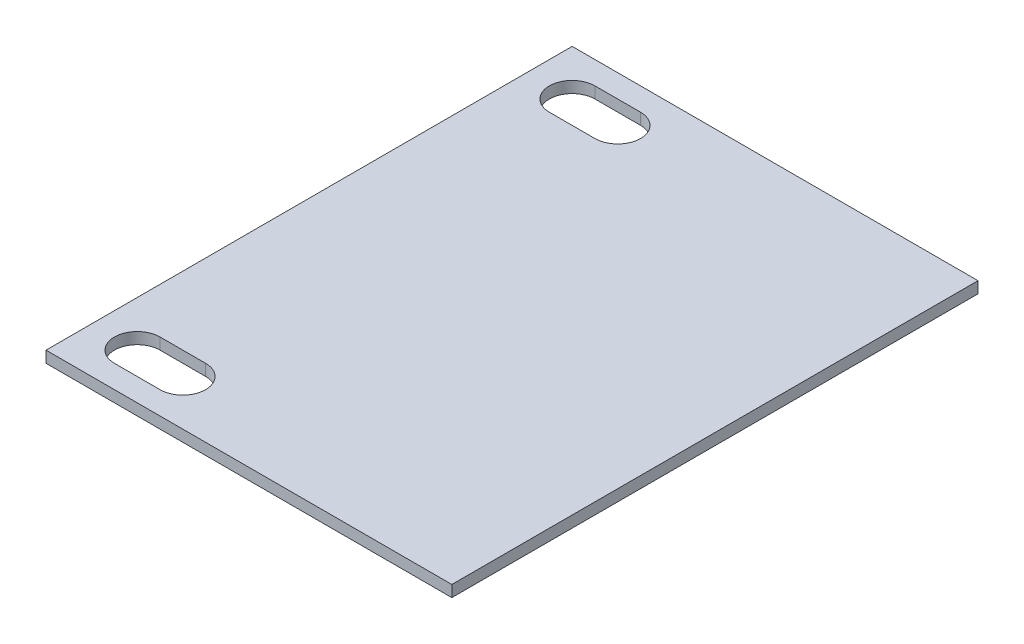
ISO-10303-21;
HEADER;
FILE_DESCRIPTION(('STEP AP214'),'2;1');
FILE_NAME('part.step','',(''),(''),'','','');
FILE_SCHEMA(('AUTOMOTIVE_DESIGN { 1 0 10303 214 1 1 1 1 }'));
ENDSEC;
DATA;
#1=APPLICATION_CONTEXT('core data for automotive mechanical design processes');
#2=APPLICATION_PROTOCOL_DEFINITION('international standard','automotive_design',2000,#1);
#3=PRODUCT_CONTEXT('',#1,'mechanical');
#4=PRODUCT('Part','Part','',(#3));
#5=PRODUCT_RELATED_PRODUCT_CATEGORY('part','',(#4));
#6=PRODUCT_DEFINITION_FORMATION('','',#4);
#7=PRODUCT_DEFINITION_CONTEXT('part definition',#1,'design');
#8=PRODUCT_DEFINITION('design','',#6,#7);
#9=PRODUCT_DEFINITION_SHAPE('','',#8);
#10=(LENGTH_UNIT() NAMED_UNIT(*) SI_UNIT(.MILLI.,.METRE.));
#11=(NAMED_UNIT(*) PLANE_ANGLE_UNIT() SI_UNIT($,.RADIAN.));
#12=(NAMED_UNIT(*) SI_UNIT($,.STERADIAN.) SOLID_ANGLE_UNIT());
#13=UNCERTAINTY_MEASURE_WITH_UNIT(LENGTH_MEASURE(1.E-05),#10,'distance_accuracy_value','');
#14=(GEOMETRIC_REPRESENTATION_CONTEXT(3) GLOBAL_UNCERTAINTY_ASSIGNED_CONTEXT((#13)) GLOBAL_UNIT_ASSIGNED_CONTEXT((#10,
#11,#12)) REPRESENTATION_CONTEXT('',''));
#15=CARTESIAN_POINT('',(0.,0.,0.));
#16=DIRECTION('',(0.,0.,1.));
#17=DIRECTION('',(1.,0.,0.));
#18=AXIS2_PLACEMENT_3D('',#15,#16,#17);
#19=CARTESIAN_POINT('',(113.,3.175,146.5));
#20=DIRECTION('',(-1.,0.,0.));
#21=DIRECTION('',(0.,0.,1.));
#22=AXIS2_PLACEMENT_3D('',#19,#20,#21);
#23=PLANE('',#22);
#24=DIRECTION('',(0.,0.,-1.));
#25=VECTOR('',#24,1.);
#26=CARTESIAN_POINT('',(113.,-3.175,146.5));
#27=LINE('',#26,#25);
#28=CARTESIAN_POINT('',(113.,-3.175,146.5));
#29=VERTEX_POINT('',#28);
#30=CARTESIAN_POINT('',(113.,-3.175,-146.5));
#31=VERTEX_POINT('',#30);
#32=EDGE_CURVE('E178',#29,#31,#27,.T.);
#33=ORIENTED_EDGE('',*,*,#32,.T.);
#34=DIRECTION('',(0.,-1.,0.));
#35=VECTOR('',#34,1.);
#36=CARTESIAN_POINT('',(113.,3.175,-146.5));
#37=LINE('',#36,#35);
#38=CARTESIAN_POINT('',(113.,3.175,-146.5));
#39=VERTEX_POINT('',#38);
#40=EDGE_CURVE('E12',#39,#31,#37,.T.);
#41=ORIENTED_EDGE('',*,*,#40,.F.);
#42=DIRECTION('',(0.,0.,-1.));
#43=VECTOR('',#42,1.);
#44=CARTESIAN_POINT('',(113.,3.175,146.5));
#45=LINE('',#44,#43);
#46=CARTESIAN_POINT('',(113.,3.175,146.5));
#47=VERTEX_POINT('',#46);
#48=EDGE_CURVE('E208',#47,#39,#45,.T.);
#49=ORIENTED_EDGE('',*,*,#48,.F.);
#50=DIRECTION('',(0.,-1.,0.));
#51=VECTOR('',#50,1.);
#52=CARTESIAN_POINT('',(113.,3.175,146.5));
#53=LINE('',#52,#51);
#54=EDGE_CURVE('E226',#47,#29,#53,.T.);
#55=ORIENTED_EDGE('',*,*,#54,.T.);
#56=EDGE_LOOP('',(#33,#41,#49,#55));
#57=FACE_BOUND('',#56,.T.);
#58=ADVANCED_FACE('F44',(#57),#23,.F.);
#59=CARTESIAN_POINT('',(-113.,3.175,-146.5));
#60=DIRECTION('',(0.,0.,1.));
#61=DIRECTION('',(1.,0.,0.));
#62=AXIS2_PLACEMENT_3D('',#59,#60,#61);
#63=PLANE('',#62);
#64=DIRECTION('',(-1.,0.,0.));
#65=VECTOR('',#64,1.);
#66=CARTESIAN_POINT('',(-113.,-3.175,-146.5));
#67=LINE('',#66,#65);
#68=CARTESIAN_POINT('',(-113.,-3.175,-146.5));
#69=VERTEX_POINT('',#68);
#70=EDGE_CURVE('E229',#31,#69,#67,.T.);
#71=ORIENTED_EDGE('',*,*,#70,.T.);
#72=DIRECTION('',(0.,-1.,0.));
#73=VECTOR('',#72,1.);
#74=CARTESIAN_POINT('',(-113.,3.175,-146.5));
#75=LINE('',#74,#73);
#76=CARTESIAN_POINT('',(-113.,3.175,-146.5));
#77=VERTEX_POINT('',#76);
#78=EDGE_CURVE('E51',#77,#69,#75,.T.);
#79=ORIENTED_EDGE('',*,*,#78,.F.);
#80=DIRECTION('',(-1.,0.,0.));
#81=VECTOR('',#80,1.);
#82=CARTESIAN_POINT('',(-113.,3.175,-146.5));
#83=LINE('',#82,#81);
#84=EDGE_CURVE('E213',#39,#77,#83,.T.);
#85=ORIENTED_EDGE('',*,*,#84,.F.);
#86=ORIENTED_EDGE('',*,*,#40,.T.);
#87=EDGE_LOOP('',(#71,#79,#85,#86));
#88=FACE_BOUND('',#87,.T.);
#89=ADVANCED_FACE('F258',(#88),#63,.F.);
#90=CARTESIAN_POINT('',(-113.,3.175,146.5));
#91=DIRECTION('',(1.,0.,0.));
#92=DIRECTION('',(0.,0.,-1.));
#93=AXIS2_PLACEMENT_3D('',#90,#91,#92);
#94=PLANE('',#93);
#95=DIRECTION('',(0.,0.,1.));
#96=VECTOR('',#95,1.);
#97=CARTESIAN_POINT('',(-113.,-3.175,146.5));
#98=LINE('',#97,#96);
#99=CARTESIAN_POINT('',(-113.,-3.175,146.5));
#100=VERTEX_POINT('',#99);
#101=EDGE_CURVE('E231',#69,#100,#98,.T.);
#102=ORIENTED_EDGE('',*,*,#101,.T.);
#103=DIRECTION('',(0.,-1.,0.));
#104=VECTOR('',#103,1.);
#105=CARTESIAN_POINT('',(-113.,3.175,146.5));
#106=LINE('',#105,#104);
#107=CARTESIAN_POINT('',(-113.,3.175,146.5));
#108=VERTEX_POINT('',#107);
#109=EDGE_CURVE('E236',#108,#100,#106,.T.);
#110=ORIENTED_EDGE('',*,*,#109,.F.);
#111=DIRECTION('',(0.,0.,1.));
#112=VECTOR('',#111,1.);
#113=CARTESIAN_POINT('',(-113.,3.175,146.5));
#114=LINE('',#113,#112);
#115=EDGE_CURVE('E219',#77,#108,#114,.T.);
#116=ORIENTED_EDGE('',*,*,#115,.F.);
#117=ORIENTED_EDGE('',*,*,#78,.T.);
#118=EDGE_LOOP('',(#102,#110,#116,#117));
#119=FACE_BOUND('',#118,.T.);
#120=ADVANCED_FACE('F243',(#119),#94,.F.);
#121=CARTESIAN_POINT('',(-113.,3.175,146.5));
#122=DIRECTION('',(0.,0.,-1.));
#123=DIRECTION('',(-1.,0.,0.));
#124=AXIS2_PLACEMENT_3D('',#121,#122,#123);
#125=PLANE('',#124);
#126=DIRECTION('',(1.,0.,0.));
#127=VECTOR('',#126,1.);
#128=CARTESIAN_POINT('',(-113.,-3.175,146.5));
#129=LINE('',#128,#127);
#130=EDGE_CURVE('E214',#100,#29,#129,.T.);
#131=ORIENTED_EDGE('',*,*,#130,.T.);
#132=ORIENTED_EDGE('',*,*,#54,.F.);
#133=DIRECTION('',(1.,0.,0.));
#134=VECTOR('',#133,1.);
#135=CARTESIAN_POINT('',(-113.,3.175,146.5));
#136=LINE('',#135,#134);
#137=EDGE_CURVE('E222',#108,#47,#136,.T.);
#138=ORIENTED_EDGE('',*,*,#137,.F.);
#139=ORIENTED_EDGE('',*,*,#109,.T.);
#140=EDGE_LOOP('',(#131,#132,#138,#139));
#141=FACE_BOUND('',#140,.T.);
#142=ADVANCED_FACE('F251',(#141),#125,.F.);
#143=CARTESIAN_POINT('',(0.,3.175,0.));
#144=DIRECTION('',(0.,-1.,0.));
#145=DIRECTION('',(0.,0.,-1.));
#146=AXIS2_PLACEMENT_3D('',#143,#144,#145);
#147=PLANE('',#146);
#148=DIRECTION('',(1.,0.,0.));
#149=VECTOR('',#148,1.);
#150=CARTESIAN_POINT('',(-87.6,3.175,-108.4));
#151=LINE('',#150,#149);
#152=CARTESIAN_POINT('',(-87.6,3.175,-108.4));
#153=VERTEX_POINT('',#152);
#154=CARTESIAN_POINT('',(-62.2,3.175,-108.4));
#155=VERTEX_POINT('',#154);
#156=EDGE_CURVE('E165',#153,#155,#151,.T.);
#157=ORIENTED_EDGE('',*,*,#156,.F.);
#158=CARTESIAN_POINT('',(-87.6,3.175,-121.1));
#159=DIRECTION('',(0.,1.,0.));
#160=DIRECTION('',(0.,0.,1.));
#161=AXIS2_PLACEMENT_3D('',#158,#159,#160);
#162=CIRCLE('',#161,12.7);
#163=CARTESIAN_POINT('',(-87.6,3.175,-133.8));
#164=VERTEX_POINT('',#163);
#165=EDGE_CURVE('E58',#164,#153,#162,.T.);
#166=ORIENTED_EDGE('',*,*,#165,.F.);
#167=DIRECTION('',(-1.,0.,0.));
#168=VECTOR('',#167,1.);
#169=CARTESIAN_POINT('',(-87.6,3.175,-133.8));
#170=LINE('',#169,#168);
#171=CARTESIAN_POINT('',(-62.2,3.175,-133.8));
#172=VERTEX_POINT('',#171);
#173=EDGE_CURVE('E153',#172,#164,#170,.T.);
#174=ORIENTED_EDGE('',*,*,#173,.F.);
#175=CARTESIAN_POINT('',(-62.2,3.175,-121.1));
#176=DIRECTION('',(0.,1.,0.));
#177=DIRECTION('',(0.,0.,1.));
#178=AXIS2_PLACEMENT_3D('',#175,#176,#177);
#179=CIRCLE('',#178,12.7);
#180=EDGE_CURVE('E157',#155,#172,#179,.T.);
#181=ORIENTED_EDGE('',*,*,#180,.F.);
#182=EDGE_LOOP('',(#157,#166,#174,#181));
#183=FACE_BOUND('',#182,.T.);
#184=DIRECTION('',(1.,0.,0.));
#185=VECTOR('',#184,1.);
#186=CARTESIAN_POINT('',(-87.6,3.175,133.8));
#187=LINE('',#186,#185);
#188=CARTESIAN_POINT('',(-87.6,3.175,133.8));
#189=VERTEX_POINT('',#188);
#190=CARTESIAN_POINT('',(-62.2,3.175,133.8));
#191=VERTEX_POINT('',#190);
#192=EDGE_CURVE('E308',#189,#191,#187,.T.);
#193=ORIENTED_EDGE('',*,*,#192,.F.);
#194=CARTESIAN_POINT('',(-87.6,3.175,121.1));
#195=DIRECTION('',(0.,1.,0.));
#196=DIRECTION('',(0.,0.,-1.));
#197=AXIS2_PLACEMENT_3D('',#194,#195,#196);
#198=CIRCLE('',#197,12.7);
#199=CARTESIAN_POINT('',(-87.6,3.175,108.4));
#200=VERTEX_POINT('',#199);
#201=EDGE_CURVE('E66',#200,#189,#198,.T.);
#202=ORIENTED_EDGE('',*,*,#201,.F.);
#203=DIRECTION('',(-1.,0.,0.));
#204=VECTOR('',#203,1.);
#205=CARTESIAN_POINT('',(-87.6,3.175,108.4));
#206=LINE('',#205,#204);
#207=CARTESIAN_POINT('',(-62.2,3.175,108.4));
#208=VERTEX_POINT('',#207);
#209=EDGE_CURVE('E191',#208,#200,#206,.T.);
#210=ORIENTED_EDGE('',*,*,#209,.F.);
#211=CARTESIAN_POINT('',(-62.2,3.175,121.1));
#212=DIRECTION('',(0.,1.,0.));
#213=DIRECTION('',(0.,0.,-1.));
#214=AXIS2_PLACEMENT_3D('',#211,#212,#213);
#215=CIRCLE('',#214,12.7);
#216=EDGE_CURVE('E196',#191,#208,#215,.T.);
#217=ORIENTED_EDGE('',*,*,#216,.F.);
#218=EDGE_LOOP('',(#193,#202,#210,#217));
#219=FACE_BOUND('',#218,.T.);
#220=ORIENTED_EDGE('',*,*,#48,.T.);
#221=ORIENTED_EDGE('',*,*,#84,.T.);
#222=ORIENTED_EDGE('',*,*,#115,.T.);
#223=ORIENTED_EDGE('',*,*,#137,.T.);
#224=EDGE_LOOP('',(#220,#221,#222,#223));
#225=FACE_BOUND('',#224,.T.);
#226=ADVANCED_FACE('F257',(#183,#219,#225),#147,.F.);
#227=CARTESIAN_POINT('',(0.,-3.175,0.));
#228=DIRECTION('',(0.,-1.,0.));
#229=DIRECTION('',(0.,0.,-1.));
#230=AXIS2_PLACEMENT_3D('',#227,#228,#229);
#231=PLANE('',#230);
#232=CARTESIAN_POINT('',(-87.6,-3.175,-121.1));
#233=DIRECTION('',(0.,1.,0.));
#234=DIRECTION('',(0.,0.,1.));
#235=AXIS2_PLACEMENT_3D('',#232,#233,#234);
#236=CIRCLE('',#235,12.7);
#237=CARTESIAN_POINT('',(-87.6,-3.175,-133.8));
#238=VERTEX_POINT('',#237);
#239=CARTESIAN_POINT('',(-87.6,-3.175,-108.4));
#240=VERTEX_POINT('',#239);
#241=EDGE_CURVE('E134',#238,#240,#236,.T.);
#242=ORIENTED_EDGE('',*,*,#241,.T.);
#243=DIRECTION('',(1.,0.,0.));
#244=VECTOR('',#243,1.);
#245=CARTESIAN_POINT('',(-87.6,-3.175,-108.4));
#246=LINE('',#245,#244);
#247=CARTESIAN_POINT('',(-62.2,-3.175,-108.4));
#248=VERTEX_POINT('',#247);
#249=EDGE_CURVE('E144',#240,#248,#246,.T.);
#250=ORIENTED_EDGE('',*,*,#249,.T.);
#251=CARTESIAN_POINT('',(-62.2,-3.175,-121.1));
#252=DIRECTION('',(0.,1.,0.));
#253=DIRECTION('',(0.,0.,1.));
#254=AXIS2_PLACEMENT_3D('',#251,#252,#253);
#255=CIRCLE('',#254,12.7);
#256=CARTESIAN_POINT('',(-62.2,-3.175,-133.8));
#257=VERTEX_POINT('',#256);
#258=EDGE_CURVE('E148',#248,#257,#255,.T.);
#259=ORIENTED_EDGE('',*,*,#258,.T.);
#260=DIRECTION('',(-1.,0.,0.));
#261=VECTOR('',#260,1.);
#262=CARTESIAN_POINT('',(-87.6,-3.175,-133.8));
#263=LINE('',#262,#261);
#264=EDGE_CURVE('E140',#257,#238,#263,.T.);
#265=ORIENTED_EDGE('',*,*,#264,.T.);
#266=EDGE_LOOP('',(#242,#250,#259,#265));
#267=FACE_BOUND('',#266,.T.);
#268=CARTESIAN_POINT('',(-87.6,-3.175,121.1));
#269=DIRECTION('',(0.,1.,0.));
#270=DIRECTION('',(0.,0.,-1.));
#271=AXIS2_PLACEMENT_3D('',#268,#269,#270);
#272=CIRCLE('',#271,12.7);
#273=CARTESIAN_POINT('',(-87.6,-3.175,108.4));
#274=VERTEX_POINT('',#273);
#275=CARTESIAN_POINT('',(-87.6,-3.175,133.8));
#276=VERTEX_POINT('',#275);
#277=EDGE_CURVE('E197',#274,#276,#272,.T.);
#278=ORIENTED_EDGE('',*,*,#277,.T.);
#279=DIRECTION('',(1.,0.,0.));
#280=VECTOR('',#279,1.);
#281=CARTESIAN_POINT('',(-87.6,-3.175,133.8));
#282=LINE('',#281,#280);
#283=CARTESIAN_POINT('',(-62.2,-3.175,133.8));
#284=VERTEX_POINT('',#283);
#285=EDGE_CURVE('E326',#276,#284,#282,.T.);
#286=ORIENTED_EDGE('',*,*,#285,.T.);
#287=CARTESIAN_POINT('',(-62.2,-3.175,121.1));
#288=DIRECTION('',(0.,1.,0.));
#289=DIRECTION('',(0.,0.,-1.));
#290=AXIS2_PLACEMENT_3D('',#287,#288,#289);
#291=CIRCLE('',#290,12.7);
#292=CARTESIAN_POINT('',(-62.2,-3.175,108.4));
#293=VERTEX_POINT('',#292);
#294=EDGE_CURVE('E322',#284,#293,#291,.T.);
#295=ORIENTED_EDGE('',*,*,#294,.T.);
#296=DIRECTION('',(-1.,0.,0.));
#297=VECTOR('',#296,1.);
#298=CARTESIAN_POINT('',(-87.6,-3.175,108.4));
#299=LINE('',#298,#297);
#300=EDGE_CURVE('E184',#293,#274,#299,.T.);
#301=ORIENTED_EDGE('',*,*,#300,.T.);
#302=EDGE_LOOP('',(#278,#286,#295,#301));
#303=FACE_BOUND('',#302,.T.);
#304=ORIENTED_EDGE('',*,*,#32,.F.);
#305=ORIENTED_EDGE('',*,*,#130,.F.);
#306=ORIENTED_EDGE('',*,*,#101,.F.);
#307=ORIENTED_EDGE('',*,*,#70,.F.);
#308=EDGE_LOOP('',(#304,#305,#306,#307));
#309=FACE_BOUND('',#308,.T.);
#310=ADVANCED_FACE('F150',(#267,#303,#309),#231,.T.);
#311=CARTESIAN_POINT('',(-87.6,-3.175,121.1));
#312=DIRECTION('',(0.,1.,0.));
#313=DIRECTION('',(0.,0.,1.));
#314=AXIS2_PLACEMENT_3D('',#311,#312,#313);
#315=CYLINDRICAL_SURFACE('',#314,12.7);
#316=ORIENTED_EDGE('',*,*,#201,.T.);
#317=DIRECTION('',(0.,1.,0.));
#318=VECTOR('',#317,1.);
#319=CARTESIAN_POINT('',(-87.6,-3.175,133.8));
#320=LINE('',#319,#318);
#321=EDGE_CURVE('E182',#276,#189,#320,.T.);
#322=ORIENTED_EDGE('',*,*,#321,.F.);
#323=ORIENTED_EDGE('',*,*,#277,.F.);
#324=DIRECTION('',(0.,1.,0.));
#325=VECTOR('',#324,1.);
#326=CARTESIAN_POINT('',(-87.6,-3.175,108.4));
#327=LINE('',#326,#325);
#328=EDGE_CURVE('E189',#274,#200,#327,.T.);
#329=ORIENTED_EDGE('',*,*,#328,.T.);
#330=EDGE_LOOP('',(#316,#322,#323,#329));
#331=FACE_BOUND('',#330,.T.);
#332=ADVANCED_FACE('F270',(#331),#315,.F.);
#333=CARTESIAN_POINT('',(-87.6,-3.175,108.4));
#334=DIRECTION('',(0.,0.,-1.));
#335=DIRECTION('',(-1.,0.,0.));
#336=AXIS2_PLACEMENT_3D('',#333,#334,#335);
#337=PLANE('',#336);
#338=ORIENTED_EDGE('',*,*,#209,.T.);
#339=ORIENTED_EDGE('',*,*,#328,.F.);
#340=ORIENTED_EDGE('',*,*,#300,.F.);
#341=DIRECTION('',(0.,1.,0.));
#342=VECTOR('',#341,1.);
#343=CARTESIAN_POINT('',(-62.2,-3.175,108.4));
#344=LINE('',#343,#342);
#345=EDGE_CURVE('E187',#293,#208,#344,.T.);
#346=ORIENTED_EDGE('',*,*,#345,.T.);
#347=EDGE_LOOP('',(#338,#339,#340,#346));
#348=FACE_BOUND('',#347,.T.);
#349=ADVANCED_FACE('F274',(#348),#337,.F.);
#350=CARTESIAN_POINT('',(-62.2,-3.175,121.1));
#351=DIRECTION('',(0.,1.,0.));
#352=DIRECTION('',(0.,0.,1.));
#353=AXIS2_PLACEMENT_3D('',#350,#351,#352);
#354=CYLINDRICAL_SURFACE('',#353,12.7);
#355=ORIENTED_EDGE('',*,*,#216,.T.);
#356=ORIENTED_EDGE('',*,*,#345,.F.);
#357=ORIENTED_EDGE('',*,*,#294,.F.);
#358=DIRECTION('',(0.,1.,0.));
#359=VECTOR('',#358,1.);
#360=CARTESIAN_POINT('',(-62.2,-3.175,133.8));
#361=LINE('',#360,#359);
#362=EDGE_CURVE('E185',#284,#191,#361,.T.);
#363=ORIENTED_EDGE('',*,*,#362,.T.);
#364=EDGE_LOOP('',(#355,#356,#357,#363));
#365=FACE_BOUND('',#364,.T.);
#366=ADVANCED_FACE('F277',(#365),#354,.F.);
#367=CARTESIAN_POINT('',(-87.6,-3.175,133.8));
#368=DIRECTION('',(0.,0.,1.));
#369=DIRECTION('',(1.,0.,0.));
#370=AXIS2_PLACEMENT_3D('',#367,#368,#369);
#371=PLANE('',#370);
#372=ORIENTED_EDGE('',*,*,#192,.T.);
#373=ORIENTED_EDGE('',*,*,#362,.F.);
#374=ORIENTED_EDGE('',*,*,#285,.F.);
#375=ORIENTED_EDGE('',*,*,#321,.T.);
#376=EDGE_LOOP('',(#372,#373,#374,#375));
#377=FACE_BOUND('',#376,.T.);
#378=ADVANCED_FACE('F281',(#377),#371,.F.);
#379=CARTESIAN_POINT('',(-87.6,-3.175,-121.1));
#380=DIRECTION('',(0.,1.,0.));
#381=DIRECTION('',(0.,0.,1.));
#382=AXIS2_PLACEMENT_3D('',#379,#380,#381);
#383=CYLINDRICAL_SURFACE('',#382,12.7);
#384=ORIENTED_EDGE('',*,*,#165,.T.);
#385=DIRECTION('',(0.,1.,0.));
#386=VECTOR('',#385,1.);
#387=CARTESIAN_POINT('',(-87.6,-3.175,-108.4));
#388=LINE('',#387,#386);
#389=EDGE_CURVE('E130',#240,#153,#388,.T.);
#390=ORIENTED_EDGE('',*,*,#389,.F.);
#391=ORIENTED_EDGE('',*,*,#241,.F.);
#392=DIRECTION('',(0.,1.,0.));
#393=VECTOR('',#392,1.);
#394=CARTESIAN_POINT('',(-87.6,-3.175,-133.8));
#395=LINE('',#394,#393);
#396=EDGE_CURVE('E176',#238,#164,#395,.T.);
#397=ORIENTED_EDGE('',*,*,#396,.T.);
#398=EDGE_LOOP('',(#384,#390,#391,#397));
#399=FACE_BOUND('',#398,.T.);
#400=ADVANCED_FACE('F132',(#399),#383,.F.);
#401=CARTESIAN_POINT('',(-87.6,-3.175,-133.8));
#402=DIRECTION('',(0.,0.,-1.));
#403=DIRECTION('',(-1.,0.,0.));
#404=AXIS2_PLACEMENT_3D('',#401,#402,#403);
#405=PLANE('',#404);
#406=ORIENTED_EDGE('',*,*,#173,.T.);
#407=ORIENTED_EDGE('',*,*,#396,.F.);
#408=ORIENTED_EDGE('',*,*,#264,.F.);
#409=DIRECTION('',(0.,1.,0.));
#410=VECTOR('',#409,1.);
#411=CARTESIAN_POINT('',(-62.2,-3.175,-133.8));
#412=LINE('',#411,#410);
#413=EDGE_CURVE('E179',#257,#172,#412,.T.);
#414=ORIENTED_EDGE('',*,*,#413,.T.);
#415=EDGE_LOOP('',(#406,#407,#408,#414));
#416=FACE_BOUND('',#415,.T.);
#417=ADVANCED_FACE('F290',(#416),#405,.F.);
#418=CARTESIAN_POINT('',(-62.2,-3.175,-121.1));
#419=DIRECTION('',(0.,1.,0.));
#420=DIRECTION('',(0.,0.,1.));
#421=AXIS2_PLACEMENT_3D('',#418,#419,#420);
#422=CYLINDRICAL_SURFACE('',#421,12.7);
#423=ORIENTED_EDGE('',*,*,#180,.T.);
#424=ORIENTED_EDGE('',*,*,#413,.F.);
#425=ORIENTED_EDGE('',*,*,#258,.F.);
#426=DIRECTION('',(0.,1.,0.));
#427=VECTOR('',#426,1.);
#428=CARTESIAN_POINT('',(-62.2,-3.175,-108.4));
#429=LINE('',#428,#427);
#430=EDGE_CURVE('E139',#248,#155,#429,.T.);
#431=ORIENTED_EDGE('',*,*,#430,.T.);
#432=EDGE_LOOP('',(#423,#424,#425,#431));
#433=FACE_BOUND('',#432,.T.);
#434=ADVANCED_FACE('F293',(#433),#422,.F.);
#435=CARTESIAN_POINT('',(-87.6,-3.175,-108.4));
#436=DIRECTION('',(0.,0.,1.));
#437=DIRECTION('',(1.,0.,0.));
#438=AXIS2_PLACEMENT_3D('',#435,#436,#437);
#439=PLANE('',#438);
#440=ORIENTED_EDGE('',*,*,#156,.T.);
#441=ORIENTED_EDGE('',*,*,#430,.F.);
#442=ORIENTED_EDGE('',*,*,#249,.F.);
#443=ORIENTED_EDGE('',*,*,#389,.T.);
#444=EDGE_LOOP('',(#440,#441,#442,#443));
#445=FACE_BOUND('',#444,.T.);
#446=ADVANCED_FACE('F145',(#445),#439,.F.);
#447=CLOSED_SHELL('',(#58,#89,#120,#142,#226,#310,#332,#349,#366,#378,#400,#417,#434,#446));
#448=MANIFOLD_SOLID_BREP('B2',#447);
#449=ADVANCED_BREP_SHAPE_REPRESENTATION('',(#18,#448),#14);
#450=SHAPE_DEFINITION_REPRESENTATION(#9,#449);
ENDSEC;
END-ISO-10303-21;
